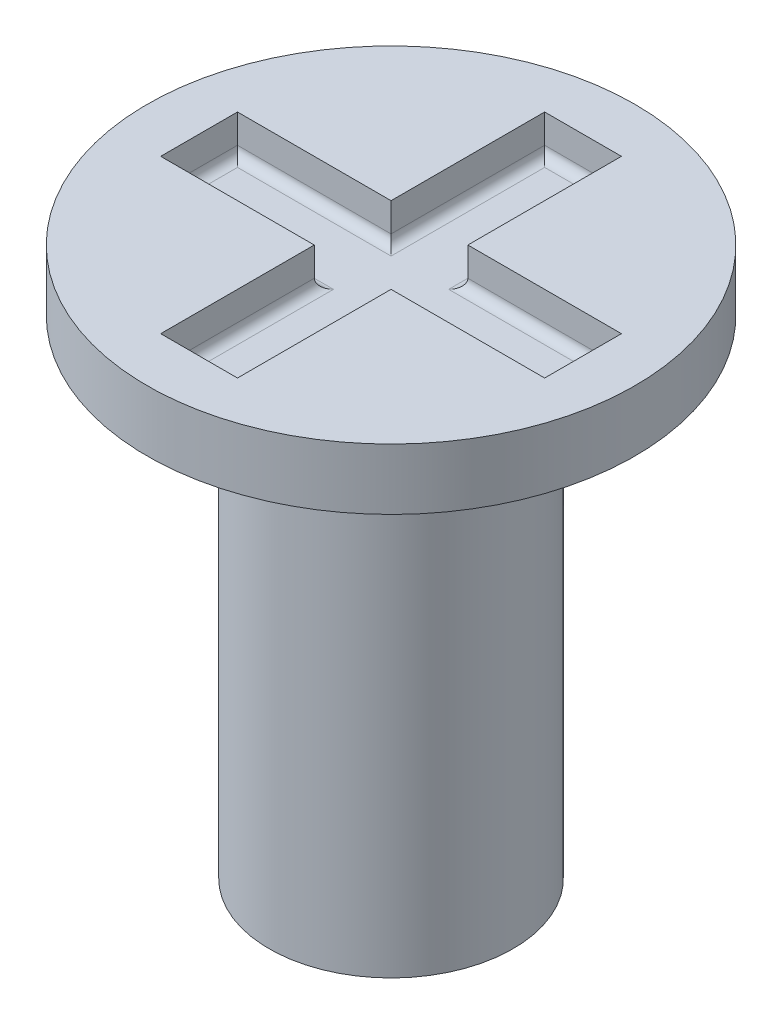
ISO-10303-21;
HEADER;
FILE_DESCRIPTION(('STEP AP214'),'2;1');
FILE_NAME('part.step','',(''),(''),'','','');
FILE_SCHEMA(('AUTOMOTIVE_DESIGN { 1 0 10303 214 1 1 1 1 }'));
ENDSEC;
DATA;
#1=APPLICATION_CONTEXT('core data for automotive mechanical design processes');
#2=APPLICATION_PROTOCOL_DEFINITION('international standard','automotive_design',2000,#1);
#3=PRODUCT_CONTEXT('',#1,'mechanical');
#4=PRODUCT('Part','Part','',(#3));
#5=PRODUCT_RELATED_PRODUCT_CATEGORY('part','',(#4));
#6=PRODUCT_DEFINITION_FORMATION('','',#4);
#7=PRODUCT_DEFINITION_CONTEXT('part definition',#1,'design');
#8=PRODUCT_DEFINITION('design','',#6,#7);
#9=PRODUCT_DEFINITION_SHAPE('','',#8);
#10=(LENGTH_UNIT() NAMED_UNIT(*) SI_UNIT(.MILLI.,.METRE.));
#11=(NAMED_UNIT(*) PLANE_ANGLE_UNIT() SI_UNIT($,.RADIAN.));
#12=(NAMED_UNIT(*) SI_UNIT($,.STERADIAN.) SOLID_ANGLE_UNIT());
#13=UNCERTAINTY_MEASURE_WITH_UNIT(LENGTH_MEASURE(1.E-05),#10,'distance_accuracy_value','');
#14=(GEOMETRIC_REPRESENTATION_CONTEXT(3) GLOBAL_UNCERTAINTY_ASSIGNED_CONTEXT((#13)) GLOBAL_UNIT_ASSIGNED_CONTEXT((#10,
#11,#12)) REPRESENTATION_CONTEXT('',''));
#15=CARTESIAN_POINT('',(0.,0.,0.));
#16=DIRECTION('',(0.,0.,1.));
#17=DIRECTION('',(1.,0.,0.));
#18=AXIS2_PLACEMENT_3D('',#15,#16,#17);
#19=CARTESIAN_POINT('',(0.,0.,0.));
#20=DIRECTION('',(0.,-1.,0.));
#21=DIRECTION('',(0.,0.,-1.));
#22=AXIS2_PLACEMENT_3D('',#19,#20,#21);
#23=PLANE('',#22);
#24=DIRECTION('',(1.,0.,0.));
#25=VECTOR('',#24,1.);
#26=CARTESIAN_POINT('',(0.675000000000001,0.,-0.5));
#27=LINE('',#26,#25);
#28=CARTESIAN_POINT('',(0.675000000000001,0.,-0.5));
#29=VERTEX_POINT('',#28);
#30=CARTESIAN_POINT('',(2.675,0.,-0.5));
#31=VERTEX_POINT('',#30);
#32=EDGE_CURVE('E239',#29,#31,#27,.T.);
#33=ORIENTED_EDGE('',*,*,#32,.T.);
#34=DIRECTION('',(0.,0.,1.));
#35=VECTOR('',#34,1.);
#36=CARTESIAN_POINT('',(2.675,0.,-2.5));
#37=LINE('',#36,#35);
#38=CARTESIAN_POINT('',(2.675,0.,-2.5));
#39=VERTEX_POINT('',#38);
#40=EDGE_CURVE('E203',#39,#31,#37,.T.);
#41=ORIENTED_EDGE('',*,*,#40,.F.);
#42=DIRECTION('',(1.,0.,0.));
#43=VECTOR('',#42,1.);
#44=CARTESIAN_POINT('',(2.675,0.,-2.5));
#45=LINE('',#44,#43);
#46=CARTESIAN_POINT('',(3.675,0.,-2.5));
#47=VERTEX_POINT('',#46);
#48=EDGE_CURVE('E214',#39,#47,#45,.T.);
#49=ORIENTED_EDGE('',*,*,#48,.T.);
#50=DIRECTION('',(0.,0.,1.));
#51=VECTOR('',#50,1.);
#52=CARTESIAN_POINT('',(3.675,0.,-2.5));
#53=LINE('',#52,#51);
#54=CARTESIAN_POINT('',(3.675,0.,-0.500000000000001));
#55=VERTEX_POINT('',#54);
#56=EDGE_CURVE('E211',#47,#55,#53,.T.);
#57=ORIENTED_EDGE('',*,*,#56,.T.);
#58=CARTESIAN_POINT('',(5.675,0.,-0.500000000000001));
#59=VERTEX_POINT('',#58);
#60=EDGE_CURVE('E238',#55,#59,#27,.T.);
#61=ORIENTED_EDGE('',*,*,#60,.T.);
#62=DIRECTION('',(0.,0.,1.));
#63=VECTOR('',#62,1.);
#64=CARTESIAN_POINT('',(5.675,0.,-0.500000000000001));
#65=LINE('',#64,#63);
#66=CARTESIAN_POINT('',(5.675,0.,0.499999999999999));
#67=VERTEX_POINT('',#66);
#68=EDGE_CURVE('E236',#59,#67,#65,.T.);
#69=ORIENTED_EDGE('',*,*,#68,.T.);
#70=DIRECTION('',(1.,0.,0.));
#71=VECTOR('',#70,1.);
#72=CARTESIAN_POINT('',(0.675000000000001,0.,0.5));
#73=LINE('',#72,#71);
#74=CARTESIAN_POINT('',(3.675,0.,0.499999999999999));
#75=VERTEX_POINT('',#74);
#76=EDGE_CURVE('E210',#75,#67,#73,.T.);
#77=ORIENTED_EDGE('',*,*,#76,.F.);
#78=CARTESIAN_POINT('',(3.675,0.,2.5));
#79=VERTEX_POINT('',#78);
#80=EDGE_CURVE('E187',#75,#79,#53,.T.);
#81=ORIENTED_EDGE('',*,*,#80,.T.);
#82=DIRECTION('',(-1.,0.,0.));
#83=VECTOR('',#82,1.);
#84=CARTESIAN_POINT('',(3.675,0.,2.5));
#85=LINE('',#84,#83);
#86=CARTESIAN_POINT('',(2.675,0.,2.5));
#87=VERTEX_POINT('',#86);
#88=EDGE_CURVE('E197',#79,#87,#85,.T.);
#89=ORIENTED_EDGE('',*,*,#88,.T.);
#90=CARTESIAN_POINT('',(2.675,0.,0.5));
#91=VERTEX_POINT('',#90);
#92=EDGE_CURVE('E342',#91,#87,#37,.T.);
#93=ORIENTED_EDGE('',*,*,#92,.F.);
#94=CARTESIAN_POINT('',(0.675000000000001,0.,0.5));
#95=VERTEX_POINT('',#94);
#96=EDGE_CURVE('E233',#95,#91,#73,.T.);
#97=ORIENTED_EDGE('',*,*,#96,.F.);
#98=DIRECTION('',(0.,0.,-1.));
#99=VECTOR('',#98,1.);
#100=CARTESIAN_POINT('',(0.675000000000001,0.,0.5));
#101=LINE('',#100,#99);
#102=EDGE_CURVE('E241',#95,#29,#101,.T.);
#103=ORIENTED_EDGE('',*,*,#102,.T.);
#104=EDGE_LOOP('',(#33,#41,#49,#57,#61,#69,#77,#81,#89,#93,#97,#103));
#105=FACE_BOUND('',#104,.T.);
#106=CARTESIAN_POINT('',(3.175,0.,0.));
#107=DIRECTION('',(0.,-1.,0.));
#108=DIRECTION('',(0.,0.,-1.));
#109=AXIS2_PLACEMENT_3D('',#106,#107,#108);
#110=CIRCLE('',#109,3.175);
#111=CARTESIAN_POINT('',(3.175,0.,-3.175));
#112=VERTEX_POINT('',#111);
#113=EDGE_CURVE('E261',#112,#112,#110,.T.);
#114=ORIENTED_EDGE('',*,*,#113,.F.);
#115=EDGE_LOOP('',(#114));
#116=FACE_BOUND('',#115,.T.);
#117=ADVANCED_FACE('F57',(#105,#116),#23,.F.);
#118=CARTESIAN_POINT('',(3.175,-7.14375,0.));
#119=DIRECTION('',(0.,-1.,0.));
#120=DIRECTION('',(0.,0.,-1.));
#121=AXIS2_PLACEMENT_3D('',#118,#119,#120);
#122=CYLINDRICAL_SURFACE('',#121,3.175);
#123=CARTESIAN_POINT('',(3.175,-0.79375,0.));
#124=DIRECTION('',(0.,-1.,0.));
#125=DIRECTION('',(0.,0.,-1.));
#126=AXIS2_PLACEMENT_3D('',#123,#124,#125);
#127=CIRCLE('',#126,3.175);
#128=CARTESIAN_POINT('',(3.175,-0.79375,-3.175));
#129=VERTEX_POINT('',#128);
#130=EDGE_CURVE('E258',#129,#129,#127,.T.);
#131=ORIENTED_EDGE('',*,*,#130,.F.);
#132=EDGE_LOOP('',(#131));
#133=FACE_BOUND('',#132,.T.);
#134=ORIENTED_EDGE('',*,*,#113,.T.);
#135=EDGE_LOOP('',(#134));
#136=FACE_BOUND('',#135,.T.);
#137=ADVANCED_FACE('F417',(#133,#136),#122,.T.);
#138=CARTESIAN_POINT('',(0.,-0.79375,0.));
#139=DIRECTION('',(0.,1.,0.));
#140=DIRECTION('',(0.,0.,1.));
#141=AXIS2_PLACEMENT_3D('',#138,#139,#140);
#142=PLANE('',#141);
#143=CARTESIAN_POINT('',(3.175,-0.79375,0.));
#144=DIRECTION('',(0.,-1.,0.));
#145=DIRECTION('',(0.,0.,-1.));
#146=AXIS2_PLACEMENT_3D('',#143,#144,#145);
#147=CIRCLE('',#146,1.5875);
#148=CARTESIAN_POINT('',(3.175,-0.79375,-1.5875));
#149=VERTEX_POINT('',#148);
#150=EDGE_CURVE('E255',#149,#149,#147,.T.);
#151=ORIENTED_EDGE('',*,*,#150,.F.);
#152=EDGE_LOOP('',(#151));
#153=FACE_BOUND('',#152,.T.);
#154=ORIENTED_EDGE('',*,*,#130,.T.);
#155=EDGE_LOOP('',(#154));
#156=FACE_BOUND('',#155,.T.);
#157=ADVANCED_FACE('F422',(#153,#156),#142,.F.);
#158=CARTESIAN_POINT('',(3.175,-7.14375,0.));
#159=DIRECTION('',(0.,-1.,0.));
#160=DIRECTION('',(0.,0.,-1.));
#161=AXIS2_PLACEMENT_3D('',#158,#159,#160);
#162=CYLINDRICAL_SURFACE('',#161,1.5875);
#163=CARTESIAN_POINT('',(3.175,-7.14375,0.));
#164=DIRECTION('',(0.,-1.,0.));
#165=DIRECTION('',(0.,0.,-1.));
#166=AXIS2_PLACEMENT_3D('',#163,#164,#165);
#167=CIRCLE('',#166,1.5875);
#168=CARTESIAN_POINT('',(3.175,-7.14375,-1.5875));
#169=VERTEX_POINT('',#168);
#170=EDGE_CURVE('E247',#169,#169,#167,.T.);
#171=ORIENTED_EDGE('',*,*,#170,.F.);
#172=EDGE_LOOP('',(#171));
#173=FACE_BOUND('',#172,.T.);
#174=ORIENTED_EDGE('',*,*,#150,.T.);
#175=EDGE_LOOP('',(#174));
#176=FACE_BOUND('',#175,.T.);
#177=ADVANCED_FACE('F618',(#173,#176),#162,.T.);
#178=CARTESIAN_POINT('',(1.5875,-7.14375,0.));
#179=DIRECTION('',(0.,1.,0.));
#180=DIRECTION('',(0.,0.,1.));
#181=AXIS2_PLACEMENT_3D('',#178,#179,#180);
#182=PLANE('',#181);
#183=ORIENTED_EDGE('',*,*,#170,.T.);
#184=EDGE_LOOP('',(#183));
#185=FACE_BOUND('',#184,.T.);
#186=ADVANCED_FACE('F611',(#185),#182,.F.);
#187=CARTESIAN_POINT('',(0.675000000000001,-0.5,0.5));
#188=DIRECTION('',(0.,0.,1.));
#189=DIRECTION('',(1.,0.,0.));
#190=AXIS2_PLACEMENT_3D('',#187,#188,#189);
#191=PLANE('',#190);
#192=DIRECTION('',(0.,1.,0.));
#193=VECTOR('',#192,1.);
#194=CARTESIAN_POINT('',(5.675,-0.5,0.499999999999999));
#195=LINE('',#194,#193);
#196=CARTESIAN_POINT('',(5.675,-0.375,0.499999999999999));
#197=VERTEX_POINT('',#196);
#198=EDGE_CURVE('E244',#197,#67,#195,.T.);
#199=ORIENTED_EDGE('',*,*,#198,.F.);
#200=DIRECTION('',(1.,0.,0.));
#201=VECTOR('',#200,1.);
#202=CARTESIAN_POINT('',(3.675,-0.375,0.499999999999999));
#203=LINE('',#202,#201);
#204=CARTESIAN_POINT('',(3.675,-0.375,0.499999999999999));
#205=VERTEX_POINT('',#204);
#206=EDGE_CURVE('E300',#197,#205,#203,.F.);
#207=ORIENTED_EDGE('',*,*,#206,.T.);
#208=DIRECTION('',(0.,-1.,0.));
#209=VECTOR('',#208,1.);
#210=CARTESIAN_POINT('',(3.675,-0.5,0.499999999999999));
#211=LINE('',#210,#209);
#212=EDGE_CURVE('E226',#75,#205,#211,.T.);
#213=ORIENTED_EDGE('',*,*,#212,.F.);
#214=ORIENTED_EDGE('',*,*,#76,.T.);
#215=EDGE_LOOP('',(#199,#207,#213,#214));
#216=FACE_BOUND('',#215,.T.);
#217=ADVANCED_FACE('F406',(#216),#191,.F.);
#218=CARTESIAN_POINT('',(0.675000000000001,-0.5,-0.5));
#219=DIRECTION('',(0.,0.,1.));
#220=DIRECTION('',(1.,0.,0.));
#221=AXIS2_PLACEMENT_3D('',#218,#219,#220);
#222=PLANE('',#221);
#223=DIRECTION('',(0.,-1.,0.));
#224=VECTOR('',#223,1.);
#225=CARTESIAN_POINT('',(3.675,-0.5,-0.500000000000001));
#226=LINE('',#225,#224);
#227=CARTESIAN_POINT('',(3.675,-0.375,-0.500000000000001));
#228=VERTEX_POINT('',#227);
#229=EDGE_CURVE('E221',#55,#228,#226,.T.);
#230=ORIENTED_EDGE('',*,*,#229,.T.);
#231=DIRECTION('',(1.,0.,0.));
#232=VECTOR('',#231,1.);
#233=CARTESIAN_POINT('',(0.675000000000001,-0.375,-0.5));
#234=LINE('',#233,#232);
#235=CARTESIAN_POINT('',(5.675,-0.375,-0.500000000000001));
#236=VERTEX_POINT('',#235);
#237=EDGE_CURVE('E296',#228,#236,#234,.T.);
#238=ORIENTED_EDGE('',*,*,#237,.T.);
#239=DIRECTION('',(0.,1.,0.));
#240=VECTOR('',#239,1.);
#241=CARTESIAN_POINT('',(5.675,-0.5,-0.500000000000001));
#242=LINE('',#241,#240);
#243=EDGE_CURVE('E250',#236,#59,#242,.T.);
#244=ORIENTED_EDGE('',*,*,#243,.T.);
#245=ORIENTED_EDGE('',*,*,#60,.F.);
#246=EDGE_LOOP('',(#230,#238,#244,#245));
#247=FACE_BOUND('',#246,.T.);
#248=ADVANCED_FACE('F382',(#247),#222,.T.);
#249=DIRECTION('',(0.,-1.,0.));
#250=VECTOR('',#249,1.);
#251=CARTESIAN_POINT('',(2.675,-0.5,0.5));
#252=LINE('',#251,#250);
#253=CARTESIAN_POINT('',(2.675,-0.375,0.5));
#254=VERTEX_POINT('',#253);
#255=EDGE_CURVE('E231',#91,#254,#252,.T.);
#256=ORIENTED_EDGE('',*,*,#255,.T.);
#257=DIRECTION('',(1.,0.,0.));
#258=VECTOR('',#257,1.);
#259=CARTESIAN_POINT('',(0.675000000000001,-0.375,0.5));
#260=LINE('',#259,#258);
#261=CARTESIAN_POINT('',(0.675000000000001,-0.375,0.5));
#262=VERTEX_POINT('',#261);
#263=EDGE_CURVE('E81',#254,#262,#260,.F.);
#264=ORIENTED_EDGE('',*,*,#263,.T.);
#265=DIRECTION('',(0.,1.,0.));
#266=VECTOR('',#265,1.);
#267=CARTESIAN_POINT('',(0.675000000000001,-0.5,0.5));
#268=LINE('',#267,#266);
#269=EDGE_CURVE('E245',#262,#95,#268,.T.);
#270=ORIENTED_EDGE('',*,*,#269,.T.);
#271=ORIENTED_EDGE('',*,*,#96,.T.);
#272=EDGE_LOOP('',(#256,#264,#270,#271));
#273=FACE_BOUND('',#272,.T.);
#274=ADVANCED_FACE('F590',(#273),#191,.F.);
#275=CARTESIAN_POINT('',(0.675000000000001,-0.5,0.5));
#276=DIRECTION('',(1.,0.,0.));
#277=DIRECTION('',(0.,0.,-1.));
#278=AXIS2_PLACEMENT_3D('',#275,#276,#277);
#279=PLANE('',#278);
#280=ORIENTED_EDGE('',*,*,#269,.F.);
#281=DIRECTION('',(0.,0.,-1.));
#282=VECTOR('',#281,1.);
#283=CARTESIAN_POINT('',(0.675000000000001,-0.375,0.5));
#284=LINE('',#283,#282);
#285=CARTESIAN_POINT('',(0.675000000000001,-0.375,-0.5));
#286=VERTEX_POINT('',#285);
#287=EDGE_CURVE('E66',#262,#286,#284,.T.);
#288=ORIENTED_EDGE('',*,*,#287,.T.);
#289=DIRECTION('',(0.,1.,0.));
#290=VECTOR('',#289,1.);
#291=CARTESIAN_POINT('',(0.675000000000001,-0.5,-0.5));
#292=LINE('',#291,#290);
#293=EDGE_CURVE('E248',#286,#29,#292,.T.);
#294=ORIENTED_EDGE('',*,*,#293,.T.);
#295=ORIENTED_EDGE('',*,*,#102,.F.);
#296=EDGE_LOOP('',(#280,#288,#294,#295));
#297=FACE_BOUND('',#296,.T.);
#298=ADVANCED_FACE('F582',(#297),#279,.T.);
#299=ORIENTED_EDGE('',*,*,#293,.F.);
#300=DIRECTION('',(1.,0.,0.));
#301=VECTOR('',#300,1.);
#302=CARTESIAN_POINT('',(0.675000000000001,-0.375,-0.5));
#303=LINE('',#302,#301);
#304=CARTESIAN_POINT('',(2.675,-0.375,-0.5));
#305=VERTEX_POINT('',#304);
#306=EDGE_CURVE('E12',#286,#305,#303,.T.);
#307=ORIENTED_EDGE('',*,*,#306,.T.);
#308=DIRECTION('',(0.,-1.,0.));
#309=VECTOR('',#308,1.);
#310=CARTESIAN_POINT('',(2.675,-0.5,-0.5));
#311=LINE('',#310,#309);
#312=EDGE_CURVE('E228',#31,#305,#311,.T.);
#313=ORIENTED_EDGE('',*,*,#312,.F.);
#314=ORIENTED_EDGE('',*,*,#32,.F.);
#315=EDGE_LOOP('',(#299,#307,#313,#314));
#316=FACE_BOUND('',#315,.T.);
#317=ADVANCED_FACE('F359',(#316),#222,.T.);
#318=CARTESIAN_POINT('',(5.675,-0.5,-0.500000000000001));
#319=DIRECTION('',(-1.,0.,0.));
#320=DIRECTION('',(0.,0.,1.));
#321=AXIS2_PLACEMENT_3D('',#318,#319,#320);
#322=PLANE('',#321);
#323=ORIENTED_EDGE('',*,*,#243,.F.);
#324=DIRECTION('',(0.,0.,1.));
#325=VECTOR('',#324,1.);
#326=CARTESIAN_POINT('',(5.675,-0.375,-0.500000000000001));
#327=LINE('',#326,#325);
#328=EDGE_CURVE('E298',#236,#197,#327,.T.);
#329=ORIENTED_EDGE('',*,*,#328,.T.);
#330=ORIENTED_EDGE('',*,*,#198,.T.);
#331=ORIENTED_EDGE('',*,*,#68,.F.);
#332=EDGE_LOOP('',(#323,#329,#330,#331));
#333=FACE_BOUND('',#332,.T.);
#334=ADVANCED_FACE('F403',(#333),#322,.T.);
#335=CARTESIAN_POINT('',(0.,-0.5,0.));
#336=DIRECTION('',(0.,-1.,0.));
#337=DIRECTION('',(-1.,0.,0.));
#338=AXIS2_PLACEMENT_3D('',#335,#336,#337);
#339=PLANE('',#338);
#340=DIRECTION('',(1.,0.,0.));
#341=VECTOR('',#340,1.);
#342=CARTESIAN_POINT('',(0.,-0.5,-2.375));
#343=LINE('',#342,#341);
#344=CARTESIAN_POINT('',(3.55,-0.5,-2.375));
#345=VERTEX_POINT('',#344);
#346=CARTESIAN_POINT('',(2.8,-0.5,-2.375));
#347=VERTEX_POINT('',#346);
#348=EDGE_CURVE('E284',#345,#347,#343,.F.);
#349=ORIENTED_EDGE('',*,*,#348,.T.);
#350=DIRECTION('',(0.,0.,1.));
#351=VECTOR('',#350,1.);
#352=CARTESIAN_POINT('',(2.8,-0.5,-0.5));
#353=LINE('',#352,#351);
#354=CARTESIAN_POINT('',(2.8,-0.5,-0.375));
#355=VERTEX_POINT('',#354);
#356=EDGE_CURVE('E286',#347,#355,#353,.T.);
#357=ORIENTED_EDGE('',*,*,#356,.T.);
#358=DIRECTION('',(1.,0.,0.));
#359=VECTOR('',#358,1.);
#360=CARTESIAN_POINT('',(0.,-0.5,-0.375));
#361=LINE('',#360,#359);
#362=CARTESIAN_POINT('',(0.800000000000001,-0.5,-0.375));
#363=VERTEX_POINT('',#362);
#364=EDGE_CURVE('E264',#355,#363,#361,.F.);
#365=ORIENTED_EDGE('',*,*,#364,.T.);
#366=DIRECTION('',(0.,0.,-1.));
#367=VECTOR('',#366,1.);
#368=CARTESIAN_POINT('',(0.800000000000001,-0.5,0.));
#369=LINE('',#368,#367);
#370=CARTESIAN_POINT('',(0.800000000000001,-0.5,0.375));
#371=VERTEX_POINT('',#370);
#372=EDGE_CURVE('E266',#363,#371,#369,.F.);
#373=ORIENTED_EDGE('',*,*,#372,.T.);
#374=DIRECTION('',(1.,0.,0.));
#375=VECTOR('',#374,1.);
#376=CARTESIAN_POINT('',(2.675,-0.5,0.375));
#377=LINE('',#376,#375);
#378=CARTESIAN_POINT('',(2.8,-0.5,0.375));
#379=VERTEX_POINT('',#378);
#380=EDGE_CURVE('E268',#371,#379,#377,.T.);
#381=ORIENTED_EDGE('',*,*,#380,.T.);
#382=DIRECTION('',(0.,0.,1.));
#383=VECTOR('',#382,1.);
#384=CARTESIAN_POINT('',(2.8,-0.5,2.5));
#385=LINE('',#384,#383);
#386=CARTESIAN_POINT('',(2.8,-0.5,2.375));
#387=VERTEX_POINT('',#386);
#388=EDGE_CURVE('E270',#379,#387,#385,.T.);
#389=ORIENTED_EDGE('',*,*,#388,.T.);
#390=DIRECTION('',(-1.,0.,0.));
#391=VECTOR('',#390,1.);
#392=CARTESIAN_POINT('',(0.,-0.5,2.375));
#393=LINE('',#392,#391);
#394=CARTESIAN_POINT('',(3.55,-0.5,2.375));
#395=VERTEX_POINT('',#394);
#396=EDGE_CURVE('E272',#387,#395,#393,.F.);
#397=ORIENTED_EDGE('',*,*,#396,.T.);
#398=DIRECTION('',(0.,0.,1.));
#399=VECTOR('',#398,1.);
#400=CARTESIAN_POINT('',(3.55,-0.5,0.));
#401=LINE('',#400,#399);
#402=CARTESIAN_POINT('',(3.55,-0.5,0.374999999999999));
#403=VERTEX_POINT('',#402);
#404=EDGE_CURVE('E274',#395,#403,#401,.F.);
#405=ORIENTED_EDGE('',*,*,#404,.T.);
#406=DIRECTION('',(1.,0.,0.));
#407=VECTOR('',#406,1.);
#408=CARTESIAN_POINT('',(5.675,-0.5,0.374999999999999));
#409=LINE('',#408,#407);
#410=CARTESIAN_POINT('',(5.55,-0.5,0.374999999999999));
#411=VERTEX_POINT('',#410);
#412=EDGE_CURVE('E276',#403,#411,#409,.T.);
#413=ORIENTED_EDGE('',*,*,#412,.T.);
#414=DIRECTION('',(0.,0.,1.));
#415=VECTOR('',#414,1.);
#416=CARTESIAN_POINT('',(5.55,-0.5,0.));
#417=LINE('',#416,#415);
#418=CARTESIAN_POINT('',(5.55,-0.5,-0.375000000000001));
#419=VERTEX_POINT('',#418);
#420=EDGE_CURVE('E278',#411,#419,#417,.F.);
#421=ORIENTED_EDGE('',*,*,#420,.T.);
#422=DIRECTION('',(1.,0.,0.));
#423=VECTOR('',#422,1.);
#424=CARTESIAN_POINT('',(0.,-0.5,-0.375));
#425=LINE('',#424,#423);
#426=CARTESIAN_POINT('',(3.55,-0.5,-0.375000000000001));
#427=VERTEX_POINT('',#426);
#428=EDGE_CURVE('E280',#419,#427,#425,.F.);
#429=ORIENTED_EDGE('',*,*,#428,.T.);
#430=DIRECTION('',(0.,0.,1.));
#431=VECTOR('',#430,1.);
#432=CARTESIAN_POINT('',(3.55,-0.5,0.));
#433=LINE('',#432,#431);
#434=EDGE_CURVE('E282',#427,#345,#433,.F.);
#435=ORIENTED_EDGE('',*,*,#434,.T.);
#436=EDGE_LOOP('',(#349,#357,#365,#373,#381,#389,#397,#405,#413,#421,#429,#435));
#437=FACE_BOUND('',#436,.T.);
#438=ADVANCED_FACE('F395',(#437),#339,.F.);
#439=CARTESIAN_POINT('',(2.675,-0.5,-2.5));
#440=DIRECTION('',(0.,0.,1.));
#441=DIRECTION('',(1.,0.,0.));
#442=AXIS2_PLACEMENT_3D('',#439,#440,#441);
#443=PLANE('',#442);
#444=DIRECTION('',(0.,1.,0.));
#445=VECTOR('',#444,1.);
#446=CARTESIAN_POINT('',(2.675,-0.5,-2.5));
#447=LINE('',#446,#445);
#448=CARTESIAN_POINT('',(2.675,-0.375,-2.5));
#449=VERTEX_POINT('',#448);
#450=EDGE_CURVE('E219',#449,#39,#447,.T.);
#451=ORIENTED_EDGE('',*,*,#450,.F.);
#452=DIRECTION('',(1.,0.,0.));
#453=VECTOR('',#452,1.);
#454=CARTESIAN_POINT('',(2.675,-0.375,-2.5));
#455=LINE('',#454,#453);
#456=CARTESIAN_POINT('',(3.675,-0.375,-2.5));
#457=VERTEX_POINT('',#456);
#458=EDGE_CURVE('E292',#449,#457,#455,.T.);
#459=ORIENTED_EDGE('',*,*,#458,.T.);
#460=DIRECTION('',(0.,1.,0.));
#461=VECTOR('',#460,1.);
#462=CARTESIAN_POINT('',(3.675,-0.5,-2.5));
#463=LINE('',#462,#461);
#464=EDGE_CURVE('E193',#457,#47,#463,.T.);
#465=ORIENTED_EDGE('',*,*,#464,.T.);
#466=ORIENTED_EDGE('',*,*,#48,.F.);
#467=EDGE_LOOP('',(#451,#459,#465,#466));
#468=FACE_BOUND('',#467,.T.);
#469=ADVANCED_FACE('F372',(#468),#443,.T.);
#470=CARTESIAN_POINT('',(3.675,-0.5,-2.5));
#471=DIRECTION('',(-1.,0.,0.));
#472=DIRECTION('',(0.,0.,1.));
#473=AXIS2_PLACEMENT_3D('',#470,#471,#472);
#474=PLANE('',#473);
#475=ORIENTED_EDGE('',*,*,#464,.F.);
#476=DIRECTION('',(0.,0.,1.));
#477=VECTOR('',#476,1.);
#478=CARTESIAN_POINT('',(3.675,-0.375,-2.5));
#479=LINE('',#478,#477);
#480=EDGE_CURVE('E294',#457,#228,#479,.T.);
#481=ORIENTED_EDGE('',*,*,#480,.T.);
#482=ORIENTED_EDGE('',*,*,#229,.F.);
#483=ORIENTED_EDGE('',*,*,#56,.F.);
#484=EDGE_LOOP('',(#475,#481,#482,#483));
#485=FACE_BOUND('',#484,.T.);
#486=ADVANCED_FACE('F378',(#485),#474,.T.);
#487=CARTESIAN_POINT('',(2.675,-0.5,-2.5));
#488=DIRECTION('',(-1.,0.,0.));
#489=DIRECTION('',(0.,0.,1.));
#490=AXIS2_PLACEMENT_3D('',#487,#488,#489);
#491=PLANE('',#490);
#492=ORIENTED_EDGE('',*,*,#312,.T.);
#493=DIRECTION('',(0.,0.,1.));
#494=VECTOR('',#493,1.);
#495=CARTESIAN_POINT('',(2.675,-0.375,-2.5));
#496=LINE('',#495,#494);
#497=EDGE_CURVE('E289',#305,#449,#496,.F.);
#498=ORIENTED_EDGE('',*,*,#497,.T.);
#499=ORIENTED_EDGE('',*,*,#450,.T.);
#500=ORIENTED_EDGE('',*,*,#40,.T.);
#501=EDGE_LOOP('',(#492,#498,#499,#500));
#502=FACE_BOUND('',#501,.T.);
#503=ADVANCED_FACE('F351',(#502),#491,.F.);
#504=DIRECTION('',(0.,1.,0.));
#505=VECTOR('',#504,1.);
#506=CARTESIAN_POINT('',(2.675,-0.5,2.5));
#507=LINE('',#506,#505);
#508=CARTESIAN_POINT('',(2.675,-0.375,2.5));
#509=VERTEX_POINT('',#508);
#510=EDGE_CURVE('E194',#509,#87,#507,.T.);
#511=ORIENTED_EDGE('',*,*,#510,.F.);
#512=DIRECTION('',(0.,0.,1.));
#513=VECTOR('',#512,1.);
#514=CARTESIAN_POINT('',(2.675,-0.375,0.5));
#515=LINE('',#514,#513);
#516=EDGE_CURVE('E305',#509,#254,#515,.F.);
#517=ORIENTED_EDGE('',*,*,#516,.T.);
#518=ORIENTED_EDGE('',*,*,#255,.F.);
#519=ORIENTED_EDGE('',*,*,#92,.T.);
#520=EDGE_LOOP('',(#511,#517,#518,#519));
#521=FACE_BOUND('',#520,.T.);
#522=ADVANCED_FACE('F534',(#521),#491,.F.);
#523=ORIENTED_EDGE('',*,*,#212,.T.);
#524=DIRECTION('',(0.,0.,1.));
#525=VECTOR('',#524,1.);
#526=CARTESIAN_POINT('',(3.675,-0.375,-2.5));
#527=LINE('',#526,#525);
#528=CARTESIAN_POINT('',(3.675,-0.375,2.5));
#529=VERTEX_POINT('',#528);
#530=EDGE_CURVE('E190',#205,#529,#527,.T.);
#531=ORIENTED_EDGE('',*,*,#530,.T.);
#532=DIRECTION('',(0.,1.,0.));
#533=VECTOR('',#532,1.);
#534=CARTESIAN_POINT('',(3.675,-0.5,2.5));
#535=LINE('',#534,#533);
#536=EDGE_CURVE('E182',#529,#79,#535,.T.);
#537=ORIENTED_EDGE('',*,*,#536,.T.);
#538=ORIENTED_EDGE('',*,*,#80,.F.);
#539=EDGE_LOOP('',(#523,#531,#537,#538));
#540=FACE_BOUND('',#539,.T.);
#541=ADVANCED_FACE('F185',(#540),#474,.T.);
#542=CARTESIAN_POINT('',(3.675,-0.5,2.5));
#543=DIRECTION('',(0.,0.,-1.));
#544=DIRECTION('',(-1.,0.,0.));
#545=AXIS2_PLACEMENT_3D('',#542,#543,#544);
#546=PLANE('',#545);
#547=ORIENTED_EDGE('',*,*,#536,.F.);
#548=DIRECTION('',(-1.,0.,0.));
#549=VECTOR('',#548,1.);
#550=CARTESIAN_POINT('',(3.675,-0.375,2.5));
#551=LINE('',#550,#549);
#552=EDGE_CURVE('E303',#529,#509,#551,.T.);
#553=ORIENTED_EDGE('',*,*,#552,.T.);
#554=ORIENTED_EDGE('',*,*,#510,.T.);
#555=ORIENTED_EDGE('',*,*,#88,.F.);
#556=EDGE_LOOP('',(#547,#553,#554,#555));
#557=FACE_BOUND('',#556,.T.);
#558=ADVANCED_FACE('F198',(#557),#546,.T.);
#559=CARTESIAN_POINT('',(3.55,-0.375,-2.5));
#560=DIRECTION('',(0.,0.,1.));
#561=DIRECTION('',(1.,0.,0.));
#562=AXIS2_PLACEMENT_3D('',#559,#560,#561);
#563=CYLINDRICAL_SURFACE('',#562,0.125);
#564=CARTESIAN_POINT('',(3.55,-0.375,2.375));
#565=DIRECTION('',(-0.707106781186547,0.,0.707106781186548));
#566=DIRECTION('',(0.707106781186548,0.,0.707106781186547));
#567=AXIS2_PLACEMENT_3D('',#564,#565,#566);
#568=ELLIPSE('',#567,0.176776695296637,0.125);
#569=EDGE_CURVE('E336',#529,#395,#568,.F.);
#570=ORIENTED_EDGE('',*,*,#569,.F.);
#571=ORIENTED_EDGE('',*,*,#530,.F.);
#572=CARTESIAN_POINT('',(3.55,-0.375,0.374999999999999));
#573=DIRECTION('',(-0.707106781186547,0.,0.707106781186548));
#574=DIRECTION('',(0.707106781186548,0.,0.707106781186547));
#575=AXIS2_PLACEMENT_3D('',#572,#573,#574);
#576=ELLIPSE('',#575,0.176776695296637,0.125);
#577=EDGE_CURVE('E61',#403,#205,#576,.T.);
#578=ORIENTED_EDGE('',*,*,#577,.F.);
#579=ORIENTED_EDGE('',*,*,#404,.F.);
#580=EDGE_LOOP('',(#570,#571,#578,#579));
#581=FACE_BOUND('',#580,.T.);
#582=ADVANCED_FACE('F59',(#581),#563,.F.);
#583=CARTESIAN_POINT('',(0.,-0.375,0.375));
#584=DIRECTION('',(-1.,0.,0.));
#585=DIRECTION('',(0.,0.,1.));
#586=AXIS2_PLACEMENT_3D('',#583,#584,#585);
#587=CYLINDRICAL_SURFACE('',#586,0.125);
#588=ORIENTED_EDGE('',*,*,#577,.T.);
#589=ORIENTED_EDGE('',*,*,#206,.F.);
#590=CARTESIAN_POINT('',(5.55,-0.375,0.374999999999999));
#591=DIRECTION('',(-0.707106781186547,0.,0.707106781186548));
#592=DIRECTION('',(0.707106781186548,0.,0.707106781186547));
#593=AXIS2_PLACEMENT_3D('',#590,#591,#592);
#594=ELLIPSE('',#593,0.176776695296637,0.125);
#595=EDGE_CURVE('E334',#411,#197,#594,.T.);
#596=ORIENTED_EDGE('',*,*,#595,.F.);
#597=ORIENTED_EDGE('',*,*,#412,.F.);
#598=EDGE_LOOP('',(#588,#589,#596,#597));
#599=FACE_BOUND('',#598,.T.);
#600=ADVANCED_FACE('F407',(#599),#587,.F.);
#601=CARTESIAN_POINT('',(3.675,-0.375,2.375));
#602=DIRECTION('',(-1.,0.,0.));
#603=DIRECTION('',(0.,0.,1.));
#604=AXIS2_PLACEMENT_3D('',#601,#602,#603);
#605=CYLINDRICAL_SURFACE('',#604,0.125);
#606=ORIENTED_EDGE('',*,*,#569,.T.);
#607=ORIENTED_EDGE('',*,*,#396,.F.);
#608=CARTESIAN_POINT('',(2.8,-0.375,2.375));
#609=DIRECTION('',(-0.707106781186548,0.,-0.707106781186547));
#610=DIRECTION('',(-0.707106781186547,0.,0.707106781186548));
#611=AXIS2_PLACEMENT_3D('',#608,#609,#610);
#612=ELLIPSE('',#611,0.176776695296637,0.125);
#613=EDGE_CURVE('E331',#509,#387,#612,.F.);
#614=ORIENTED_EDGE('',*,*,#613,.F.);
#615=ORIENTED_EDGE('',*,*,#552,.F.);
#616=EDGE_LOOP('',(#606,#607,#614,#615));
#617=FACE_BOUND('',#616,.T.);
#618=ADVANCED_FACE('F409',(#617),#605,.F.);
#619=CARTESIAN_POINT('',(5.55,-0.375,-0.500000000000001));
#620=DIRECTION('',(0.,0.,1.));
#621=DIRECTION('',(1.,0.,0.));
#622=AXIS2_PLACEMENT_3D('',#619,#620,#621);
#623=CYLINDRICAL_SURFACE('',#622,0.125);
#624=ORIENTED_EDGE('',*,*,#595,.T.);
#625=ORIENTED_EDGE('',*,*,#328,.F.);
#626=CARTESIAN_POINT('',(5.55,-0.375,-0.375000000000001));
#627=DIRECTION('',(0.707106781186548,0.,0.707106781186547));
#628=DIRECTION('',(0.707106781186547,0.,-0.707106781186548));
#629=AXIS2_PLACEMENT_3D('',#626,#627,#628);
#630=ELLIPSE('',#629,0.176776695296637,0.125);
#631=EDGE_CURVE('E328',#419,#236,#630,.T.);
#632=ORIENTED_EDGE('',*,*,#631,.F.);
#633=ORIENTED_EDGE('',*,*,#420,.F.);
#634=EDGE_LOOP('',(#624,#625,#632,#633));
#635=FACE_BOUND('',#634,.T.);
#636=ADVANCED_FACE('F400',(#635),#623,.F.);
#637=CARTESIAN_POINT('',(2.8,-0.375,0.));
#638=DIRECTION('',(0.,0.,-1.));
#639=DIRECTION('',(-1.,0.,0.));
#640=AXIS2_PLACEMENT_3D('',#637,#638,#639);
#641=CYLINDRICAL_SURFACE('',#640,0.125);
#642=ORIENTED_EDGE('',*,*,#613,.T.);
#643=ORIENTED_EDGE('',*,*,#388,.F.);
#644=CARTESIAN_POINT('',(2.8,-0.375,0.375));
#645=DIRECTION('',(-0.707106781186548,0.,-0.707106781186547));
#646=DIRECTION('',(-0.707106781186547,0.,0.707106781186548));
#647=AXIS2_PLACEMENT_3D('',#644,#645,#646);
#648=ELLIPSE('',#647,0.176776695296637,0.125);
#649=EDGE_CURVE('E325',#254,#379,#648,.F.);
#650=ORIENTED_EDGE('',*,*,#649,.F.);
#651=ORIENTED_EDGE('',*,*,#516,.F.);
#652=EDGE_LOOP('',(#642,#643,#650,#651));
#653=FACE_BOUND('',#652,.T.);
#654=ADVANCED_FACE('F447',(#653),#641,.F.);
#655=CARTESIAN_POINT('',(0.675000000000001,-0.375,-0.375));
#656=DIRECTION('',(1.,0.,0.));
#657=DIRECTION('',(0.,0.,-1.));
#658=AXIS2_PLACEMENT_3D('',#655,#656,#657);
#659=CYLINDRICAL_SURFACE('',#658,0.125);
#660=ORIENTED_EDGE('',*,*,#631,.T.);
#661=ORIENTED_EDGE('',*,*,#237,.F.);
#662=CARTESIAN_POINT('',(3.55,-0.375,-0.375000000000001));
#663=DIRECTION('',(0.707106781186548,0.,0.707106781186547));
#664=DIRECTION('',(0.707106781186547,0.,-0.707106781186548));
#665=AXIS2_PLACEMENT_3D('',#662,#663,#664);
#666=ELLIPSE('',#665,0.176776695296637,0.125);
#667=EDGE_CURVE('E322',#427,#228,#666,.T.);
#668=ORIENTED_EDGE('',*,*,#667,.F.);
#669=ORIENTED_EDGE('',*,*,#428,.F.);
#670=EDGE_LOOP('',(#660,#661,#668,#669));
#671=FACE_BOUND('',#670,.T.);
#672=ADVANCED_FACE('F386',(#671),#659,.F.);
#673=CARTESIAN_POINT('',(0.,-0.375,0.375));
#674=DIRECTION('',(-1.,0.,0.));
#675=DIRECTION('',(0.,0.,1.));
#676=AXIS2_PLACEMENT_3D('',#673,#674,#675);
#677=CYLINDRICAL_SURFACE('',#676,0.125);
#678=ORIENTED_EDGE('',*,*,#649,.T.);
#679=ORIENTED_EDGE('',*,*,#380,.F.);
#680=CARTESIAN_POINT('',(0.800000000000001,-0.375,0.375));
#681=DIRECTION('',(-0.707106781186548,0.,-0.707106781186547));
#682=DIRECTION('',(-0.707106781186547,0.,0.707106781186548));
#683=AXIS2_PLACEMENT_3D('',#680,#681,#682);
#684=ELLIPSE('',#683,0.176776695296637,0.125);
#685=EDGE_CURVE('E319',#262,#371,#684,.F.);
#686=ORIENTED_EDGE('',*,*,#685,.F.);
#687=ORIENTED_EDGE('',*,*,#263,.F.);
#688=EDGE_LOOP('',(#678,#679,#686,#687));
#689=FACE_BOUND('',#688,.T.);
#690=ADVANCED_FACE('F441',(#689),#677,.F.);
#691=CARTESIAN_POINT('',(3.55,-0.375,-2.5));
#692=DIRECTION('',(0.,0.,1.));
#693=DIRECTION('',(1.,0.,0.));
#694=AXIS2_PLACEMENT_3D('',#691,#692,#693);
#695=CYLINDRICAL_SURFACE('',#694,0.125);
#696=ORIENTED_EDGE('',*,*,#667,.T.);
#697=ORIENTED_EDGE('',*,*,#480,.F.);
#698=CARTESIAN_POINT('',(3.55,-0.375,-2.375));
#699=DIRECTION('',(0.707106781186548,0.,0.707106781186547));
#700=DIRECTION('',(0.707106781186547,0.,-0.707106781186548));
#701=AXIS2_PLACEMENT_3D('',#698,#699,#700);
#702=ELLIPSE('',#701,0.176776695296637,0.125);
#703=EDGE_CURVE('E316',#345,#457,#702,.T.);
#704=ORIENTED_EDGE('',*,*,#703,.F.);
#705=ORIENTED_EDGE('',*,*,#434,.F.);
#706=EDGE_LOOP('',(#696,#697,#704,#705));
#707=FACE_BOUND('',#706,.T.);
#708=ADVANCED_FACE('F391',(#707),#695,.F.);
#709=CARTESIAN_POINT('',(0.800000000000001,-0.375,0.5));
#710=DIRECTION('',(0.,0.,-1.));
#711=DIRECTION('',(-1.,0.,0.));
#712=AXIS2_PLACEMENT_3D('',#709,#710,#711);
#713=CYLINDRICAL_SURFACE('',#712,0.125);
#714=ORIENTED_EDGE('',*,*,#685,.T.);
#715=ORIENTED_EDGE('',*,*,#372,.F.);
#716=CARTESIAN_POINT('',(0.800000000000001,-0.375,-0.375));
#717=DIRECTION('',(0.707106781186547,0.,-0.707106781186548));
#718=DIRECTION('',(-0.707106781186548,0.,-0.707106781186547));
#719=AXIS2_PLACEMENT_3D('',#716,#717,#718);
#720=ELLIPSE('',#719,0.176776695296637,0.125);
#721=EDGE_CURVE('E313',#286,#363,#720,.F.);
#722=ORIENTED_EDGE('',*,*,#721,.F.);
#723=ORIENTED_EDGE('',*,*,#287,.F.);
#724=EDGE_LOOP('',(#714,#715,#722,#723));
#725=FACE_BOUND('',#724,.T.);
#726=ADVANCED_FACE('F434',(#725),#713,.F.);
#727=CARTESIAN_POINT('',(2.675,-0.375,-2.375));
#728=DIRECTION('',(1.,0.,0.));
#729=DIRECTION('',(0.,0.,-1.));
#730=AXIS2_PLACEMENT_3D('',#727,#728,#729);
#731=CYLINDRICAL_SURFACE('',#730,0.125);
#732=ORIENTED_EDGE('',*,*,#703,.T.);
#733=ORIENTED_EDGE('',*,*,#458,.F.);
#734=CARTESIAN_POINT('',(2.8,-0.375,-2.375));
#735=DIRECTION('',(0.707106781186547,0.,-0.707106781186548));
#736=DIRECTION('',(-0.707106781186548,0.,-0.707106781186547));
#737=AXIS2_PLACEMENT_3D('',#734,#735,#736);
#738=ELLIPSE('',#737,0.176776695296637,0.125);
#739=EDGE_CURVE('E311',#347,#449,#738,.T.);
#740=ORIENTED_EDGE('',*,*,#739,.F.);
#741=ORIENTED_EDGE('',*,*,#348,.F.);
#742=EDGE_LOOP('',(#732,#733,#740,#741));
#743=FACE_BOUND('',#742,.T.);
#744=ADVANCED_FACE('F431',(#743),#731,.F.);
#745=CARTESIAN_POINT('',(0.675000000000001,-0.375,-0.375));
#746=DIRECTION('',(1.,0.,0.));
#747=DIRECTION('',(0.,0.,-1.));
#748=AXIS2_PLACEMENT_3D('',#745,#746,#747);
#749=CYLINDRICAL_SURFACE('',#748,0.125);
#750=ORIENTED_EDGE('',*,*,#721,.T.);
#751=ORIENTED_EDGE('',*,*,#364,.F.);
#752=CARTESIAN_POINT('',(2.8,-0.375,-0.375));
#753=DIRECTION('',(0.707106781186547,0.,-0.707106781186548));
#754=DIRECTION('',(0.707106781186548,0.,0.707106781186547));
#755=AXIS2_PLACEMENT_3D('',#752,#753,#754);
#756=ELLIPSE('',#755,0.176776695296637,0.125);
#757=EDGE_CURVE('E309',#305,#355,#756,.F.);
#758=ORIENTED_EDGE('',*,*,#757,.F.);
#759=ORIENTED_EDGE('',*,*,#306,.F.);
#760=EDGE_LOOP('',(#750,#751,#758,#759));
#761=FACE_BOUND('',#760,.T.);
#762=ADVANCED_FACE('F364',(#761),#749,.F.);
#763=CARTESIAN_POINT('',(2.8,-0.375,0.));
#764=DIRECTION('',(0.,0.,-1.));
#765=DIRECTION('',(-1.,0.,0.));
#766=AXIS2_PLACEMENT_3D('',#763,#764,#765);
#767=CYLINDRICAL_SURFACE('',#766,0.125);
#768=ORIENTED_EDGE('',*,*,#739,.T.);
#769=ORIENTED_EDGE('',*,*,#497,.F.);
#770=ORIENTED_EDGE('',*,*,#757,.T.);
#771=ORIENTED_EDGE('',*,*,#356,.F.);
#772=EDGE_LOOP('',(#768,#769,#770,#771));
#773=FACE_BOUND('',#772,.T.);
#774=ADVANCED_FACE('F368',(#773),#767,.F.);
#775=CLOSED_SHELL('',(#117,#137,#157,#177,#186,#217,#248,#274,#298,#317,#334,#438,#469,#486,
#503,#522,#541,#558,#582,#600,#618,#636,#654,#672,#690,#708,#726,#744,#762,#774));
#776=MANIFOLD_SOLID_BREP('B2',#775);
#777=ADVANCED_BREP_SHAPE_REPRESENTATION('',(#18,#776),#14);
#778=SHAPE_DEFINITION_REPRESENTATION(#9,#777);
ENDSEC;
END-ISO-10303-21;
